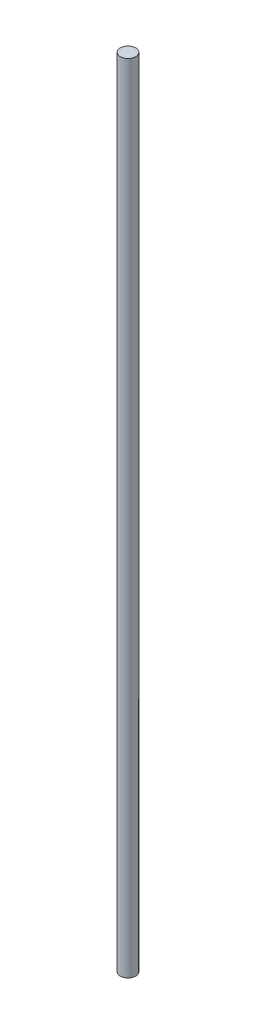
ISO-10303-21;
HEADER;
FILE_DESCRIPTION(('STEP AP214'),'2;1');
FILE_NAME('part.step','',(''),(''),'','','');
FILE_SCHEMA(('AUTOMOTIVE_DESIGN { 1 0 10303 214 1 1 1 1 }'));
ENDSEC;
DATA;
#1=APPLICATION_CONTEXT('core data for automotive mechanical design processes');
#2=APPLICATION_PROTOCOL_DEFINITION('international standard','automotive_design',2000,#1);
#3=PRODUCT_CONTEXT('',#1,'mechanical');
#4=PRODUCT('Part','Part','',(#3));
#5=PRODUCT_RELATED_PRODUCT_CATEGORY('part','',(#4));
#6=PRODUCT_DEFINITION_FORMATION('','',#4);
#7=PRODUCT_DEFINITION_CONTEXT('part definition',#1,'design');
#8=PRODUCT_DEFINITION('design','',#6,#7);
#9=PRODUCT_DEFINITION_SHAPE('','',#8);
#10=(LENGTH_UNIT() NAMED_UNIT(*) SI_UNIT(.MILLI.,.METRE.));
#11=(NAMED_UNIT(*) PLANE_ANGLE_UNIT() SI_UNIT($,.RADIAN.));
#12=(NAMED_UNIT(*) SI_UNIT($,.STERADIAN.) SOLID_ANGLE_UNIT());
#13=UNCERTAINTY_MEASURE_WITH_UNIT(LENGTH_MEASURE(1.E-05),#10,'distance_accuracy_value','');
#14=(GEOMETRIC_REPRESENTATION_CONTEXT(3) GLOBAL_UNCERTAINTY_ASSIGNED_CONTEXT((#13)) GLOBAL_UNIT_ASSIGNED_CONTEXT((#10,
#11,#12)) REPRESENTATION_CONTEXT('',''));
#15=CARTESIAN_POINT('',(0.,0.,0.));
#16=DIRECTION('',(0.,0.,1.));
#17=DIRECTION('',(1.,0.,0.));
#18=AXIS2_PLACEMENT_3D('',#15,#16,#17);
#19=CARTESIAN_POINT('',(0.,330.2,0.));
#20=DIRECTION('',(0.,-1.,0.));
#21=DIRECTION('',(0.,0.,-1.));
#22=AXIS2_PLACEMENT_3D('',#19,#20,#21);
#23=CYLINDRICAL_SURFACE('',#22,3.175);
#24=CARTESIAN_POINT('',(0.,330.2,0.));
#25=DIRECTION('',(0.,1.,0.));
#26=DIRECTION('',(0.,0.,1.));
#27=AXIS2_PLACEMENT_3D('',#24,#25,#26);
#28=CIRCLE('',#27,3.175);
#29=CARTESIAN_POINT('',(0.,330.2,3.175));
#30=VERTEX_POINT('',#29);
#31=EDGE_CURVE('E10',#30,#30,#28,.T.);
#32=ORIENTED_EDGE('',*,*,#31,.F.);
#33=EDGE_LOOP('',(#32));
#34=FACE_BOUND('',#33,.T.);
#35=CARTESIAN_POINT('',(0.,0.,0.));
#36=DIRECTION('',(0.,1.,0.));
#37=DIRECTION('',(0.,0.,1.));
#38=AXIS2_PLACEMENT_3D('',#35,#36,#37);
#39=CIRCLE('',#38,3.175);
#40=CARTESIAN_POINT('',(0.,0.,3.175));
#41=VERTEX_POINT('',#40);
#42=EDGE_CURVE('E46',#41,#41,#39,.T.);
#43=ORIENTED_EDGE('',*,*,#42,.T.);
#44=EDGE_LOOP('',(#43));
#45=FACE_BOUND('',#44,.T.);
#46=ADVANCED_FACE('F43',(#34,#45),#23,.T.);
#47=CARTESIAN_POINT('',(0.,330.2,0.));
#48=DIRECTION('',(0.,1.,0.));
#49=DIRECTION('',(0.,0.,1.));
#50=AXIS2_PLACEMENT_3D('',#47,#48,#49);
#51=PLANE('',#50);
#52=ORIENTED_EDGE('',*,*,#31,.T.);
#53=EDGE_LOOP('',(#52));
#54=FACE_BOUND('',#53,.T.);
#55=ADVANCED_FACE('F58',(#54),#51,.T.);
#56=CARTESIAN_POINT('',(0.,0.,0.));
#57=DIRECTION('',(0.,1.,0.));
#58=DIRECTION('',(0.,0.,1.));
#59=AXIS2_PLACEMENT_3D('',#56,#57,#58);
#60=PLANE('',#59);
#61=ORIENTED_EDGE('',*,*,#42,.F.);
#62=EDGE_LOOP('',(#61));
#63=FACE_BOUND('',#62,.T.);
#64=ADVANCED_FACE('F59',(#63),#60,.F.);
#65=CLOSED_SHELL('',(#46,#55,#64));
#66=MANIFOLD_SOLID_BREP('B2',#65);
#67=ADVANCED_BREP_SHAPE_REPRESENTATION('',(#18,#66),#14);
#68=SHAPE_DEFINITION_REPRESENTATION(#9,#67);
ENDSEC;
END-ISO-10303-21;
